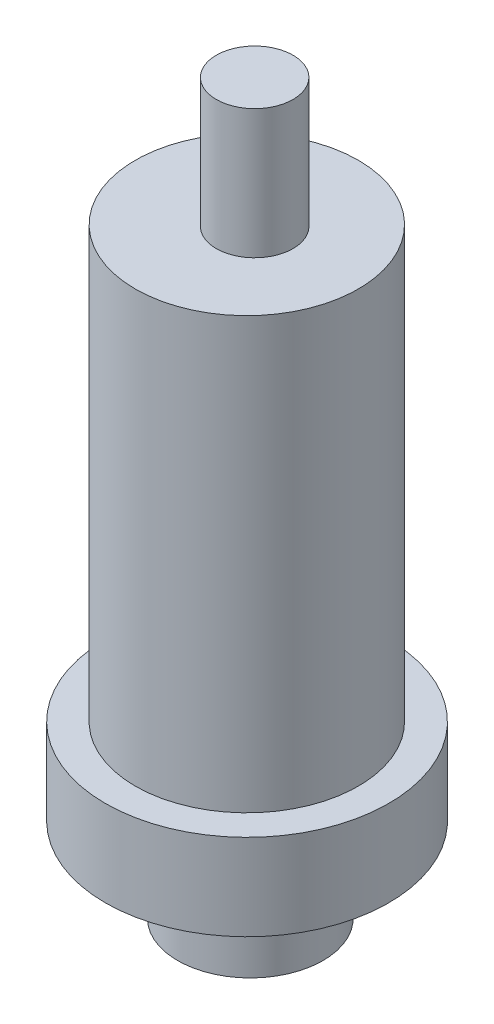
ISO-10303-21;
HEADER;
FILE_DESCRIPTION(('STEP AP214'),'2;1');
FILE_NAME('part.step','',(''),(''),'','','');
FILE_SCHEMA(('AUTOMOTIVE_DESIGN { 1 0 10303 214 1 1 1 1 }'));
ENDSEC;
DATA;
#1=APPLICATION_CONTEXT('core data for automotive mechanical design processes');
#2=APPLICATION_PROTOCOL_DEFINITION('international standard','automotive_design',2000,#1);
#3=PRODUCT_CONTEXT('',#1,'mechanical');
#4=PRODUCT('Part','Part','',(#3));
#5=PRODUCT_RELATED_PRODUCT_CATEGORY('part','',(#4));
#6=PRODUCT_DEFINITION_FORMATION('','',#4);
#7=PRODUCT_DEFINITION_CONTEXT('part definition',#1,'design');
#8=PRODUCT_DEFINITION('design','',#6,#7);
#9=PRODUCT_DEFINITION_SHAPE('','',#8);
#10=(LENGTH_UNIT() NAMED_UNIT(*) SI_UNIT(.MILLI.,.METRE.));
#11=(NAMED_UNIT(*) PLANE_ANGLE_UNIT() SI_UNIT($,.RADIAN.));
#12=(NAMED_UNIT(*) SI_UNIT($,.STERADIAN.) SOLID_ANGLE_UNIT());
#13=UNCERTAINTY_MEASURE_WITH_UNIT(LENGTH_MEASURE(1.E-05),#10,'distance_accuracy_value','');
#14=(GEOMETRIC_REPRESENTATION_CONTEXT(3) GLOBAL_UNCERTAINTY_ASSIGNED_CONTEXT((#13)) GLOBAL_UNIT_ASSIGNED_CONTEXT((#10,
#11,#12)) REPRESENTATION_CONTEXT('',''));
#15=CARTESIAN_POINT('',(0.,0.,0.));
#16=DIRECTION('',(0.,0.,1.));
#17=DIRECTION('',(1.,0.,0.));
#18=AXIS2_PLACEMENT_3D('',#15,#16,#17);
#19=CARTESIAN_POINT('',(0.,10.,-1.80088060511707));
#20=DIRECTION('',(0.,-1.,0.));
#21=DIRECTION('',(0.,0.,-1.));
#22=AXIS2_PLACEMENT_3D('',#19,#20,#21);
#23=CYLINDRICAL_SURFACE('',#22,16.4579037746839);
#24=CARTESIAN_POINT('',(0.,10.,-1.80088060511707));
#25=DIRECTION('',(0.,1.,0.));
#26=DIRECTION('',(0.,0.,1.));
#27=AXIS2_PLACEMENT_3D('',#24,#25,#26);
#28=CIRCLE('',#27,16.4579037746839);
#29=CARTESIAN_POINT('',(0.,10.,14.6570231695668));
#30=VERTEX_POINT('',#29);
#31=EDGE_CURVE('E57',#30,#30,#28,.T.);
#32=ORIENTED_EDGE('',*,*,#31,.F.);
#33=EDGE_LOOP('',(#32));
#34=FACE_BOUND('',#33,.T.);
#35=CARTESIAN_POINT('',(0.,0.,-1.80088060511707));
#36=DIRECTION('',(0.,1.,0.));
#37=DIRECTION('',(0.,0.,1.));
#38=AXIS2_PLACEMENT_3D('',#35,#36,#37);
#39=CIRCLE('',#38,16.4579037746839);
#40=CARTESIAN_POINT('',(0.,0.,14.6570231695668));
#41=VERTEX_POINT('',#40);
#42=EDGE_CURVE('E36',#41,#41,#39,.T.);
#43=ORIENTED_EDGE('',*,*,#42,.T.);
#44=EDGE_LOOP('',(#43));
#45=FACE_BOUND('',#44,.T.);
#46=ADVANCED_FACE('F33',(#34,#45),#23,.T.);
#47=CARTESIAN_POINT('',(0.,10.,-1.80088060511707));
#48=DIRECTION('',(0.,1.,0.));
#49=DIRECTION('',(0.,0.,1.));
#50=AXIS2_PLACEMENT_3D('',#47,#48,#49);
#51=PLANE('',#50);
#52=CARTESIAN_POINT('',(0.,10.,-1.7734498814086));
#53=DIRECTION('',(0.,1.,0.));
#54=DIRECTION('',(0.,0.,1.));
#55=AXIS2_PLACEMENT_3D('',#52,#53,#54);
#56=CIRCLE('',#55,12.9535496853533);
#57=CARTESIAN_POINT('',(0.,10.,11.1800998039447));
#58=VERTEX_POINT('',#57);
#59=EDGE_CURVE('E45',#58,#58,#56,.T.);
#60=ORIENTED_EDGE('',*,*,#59,.F.);
#61=EDGE_LOOP('',(#60));
#62=FACE_BOUND('',#61,.T.);
#63=ORIENTED_EDGE('',*,*,#31,.T.);
#64=EDGE_LOOP('',(#63));
#65=FACE_BOUND('',#64,.T.);
#66=ADVANCED_FACE('F68',(#62,#65),#51,.T.);
#67=CARTESIAN_POINT('',(0.,0.,-1.80088060511707));
#68=DIRECTION('',(0.,1.,0.));
#69=DIRECTION('',(0.,0.,1.));
#70=AXIS2_PLACEMENT_3D('',#67,#68,#69);
#71=PLANE('',#70);
#72=CARTESIAN_POINT('',(0.,0.,-2.17889203507582));
#73=DIRECTION('',(0.,-1.,0.));
#74=DIRECTION('',(0.,0.,-1.));
#75=AXIS2_PLACEMENT_3D('',#72,#73,#74);
#76=CIRCLE('',#75,8.44633714454265);
#77=CARTESIAN_POINT('',(0.,0.,-10.6252291796185));
#78=VERTEX_POINT('',#77);
#79=EDGE_CURVE('E40',#78,#78,#76,.T.);
#80=ORIENTED_EDGE('',*,*,#79,.F.);
#81=EDGE_LOOP('',(#80));
#82=FACE_BOUND('',#81,.T.);
#83=ORIENTED_EDGE('',*,*,#42,.F.);
#84=EDGE_LOOP('',(#83));
#85=FACE_BOUND('',#84,.T.);
#86=ADVANCED_FACE('F65',(#82,#85),#71,.F.);
#87=CARTESIAN_POINT('',(0.,60.,-1.7734498814086));
#88=DIRECTION('',(0.,-1.,0.));
#89=DIRECTION('',(0.,0.,-1.));
#90=AXIS2_PLACEMENT_3D('',#87,#88,#89);
#91=CYLINDRICAL_SURFACE('',#90,12.9535496853533);
#92=CARTESIAN_POINT('',(0.,60.,-1.7734498814086));
#93=DIRECTION('',(0.,1.,0.));
#94=DIRECTION('',(0.,0.,1.));
#95=AXIS2_PLACEMENT_3D('',#92,#93,#94);
#96=CIRCLE('',#95,12.9535496853533);
#97=CARTESIAN_POINT('',(0.,60.,11.1800998039447));
#98=VERTEX_POINT('',#97);
#99=EDGE_CURVE('E52',#98,#98,#96,.T.);
#100=ORIENTED_EDGE('',*,*,#99,.F.);
#101=EDGE_LOOP('',(#100));
#102=FACE_BOUND('',#101,.T.);
#103=ORIENTED_EDGE('',*,*,#59,.T.);
#104=EDGE_LOOP('',(#103));
#105=FACE_BOUND('',#104,.T.);
#106=ADVANCED_FACE('F67',(#102,#105),#91,.T.);
#107=CARTESIAN_POINT('',(0.,60.,-1.7734498814086));
#108=DIRECTION('',(0.,1.,0.));
#109=DIRECTION('',(0.,0.,1.));
#110=AXIS2_PLACEMENT_3D('',#107,#108,#109);
#111=PLANE('',#110);
#112=CARTESIAN_POINT('',(0.642895668787169,60.,-2.04178418553891));
#113=DIRECTION('',(0.,1.,0.));
#114=DIRECTION('',(0.,0.,1.));
#115=AXIS2_PLACEMENT_3D('',#112,#113,#114);
#116=CIRCLE('',#115,4.45625116763635);
#117=CARTESIAN_POINT('',(0.642895668787169,60.,2.41446698209744));
#118=VERTEX_POINT('',#117);
#119=EDGE_CURVE('E10',#118,#118,#116,.T.);
#120=ORIENTED_EDGE('',*,*,#119,.F.);
#121=EDGE_LOOP('',(#120));
#122=FACE_BOUND('',#121,.T.);
#123=ORIENTED_EDGE('',*,*,#99,.T.);
#124=EDGE_LOOP('',(#123));
#125=FACE_BOUND('',#124,.T.);
#126=ADVANCED_FACE('F74',(#122,#125),#111,.T.);
#127=CARTESIAN_POINT('',(0.,-10.,-2.17889203507582));
#128=DIRECTION('',(0.,1.,0.));
#129=DIRECTION('',(0.,0.,1.));
#130=AXIS2_PLACEMENT_3D('',#127,#128,#129);
#131=CYLINDRICAL_SURFACE('',#130,8.44633714454265);
#132=CARTESIAN_POINT('',(0.,-10.,-2.17889203507582));
#133=DIRECTION('',(0.,-1.,0.));
#134=DIRECTION('',(0.,0.,-1.));
#135=AXIS2_PLACEMENT_3D('',#132,#133,#134);
#136=CIRCLE('',#135,8.44633714454265);
#137=CARTESIAN_POINT('',(0.,-10.,-10.6252291796185));
#138=VERTEX_POINT('',#137);
#139=EDGE_CURVE('E50',#138,#138,#136,.T.);
#140=ORIENTED_EDGE('',*,*,#139,.F.);
#141=EDGE_LOOP('',(#140));
#142=FACE_BOUND('',#141,.T.);
#143=ORIENTED_EDGE('',*,*,#79,.T.);
#144=EDGE_LOOP('',(#143));
#145=FACE_BOUND('',#144,.T.);
#146=ADVANCED_FACE('F105',(#142,#145),#131,.T.);
#147=CARTESIAN_POINT('',(0.,-10.,-2.17889203507582));
#148=DIRECTION('',(0.,-1.,0.));
#149=DIRECTION('',(0.,0.,-1.));
#150=AXIS2_PLACEMENT_3D('',#147,#148,#149);
#151=PLANE('',#150);
#152=ORIENTED_EDGE('',*,*,#139,.T.);
#153=EDGE_LOOP('',(#152));
#154=FACE_BOUND('',#153,.T.);
#155=ADVANCED_FACE('F110',(#154),#151,.T.);
#156=CARTESIAN_POINT('',(0.642895668787169,75.,-2.04178418553891));
#157=DIRECTION('',(0.,-1.,0.));
#158=DIRECTION('',(0.,0.,-1.));
#159=AXIS2_PLACEMENT_3D('',#156,#157,#158);
#160=CYLINDRICAL_SURFACE('',#159,4.45625116763635);
#161=CARTESIAN_POINT('',(0.642895668787169,75.,-2.04178418553891));
#162=DIRECTION('',(0.,1.,0.));
#163=DIRECTION('',(0.,0.,1.));
#164=AXIS2_PLACEMENT_3D('',#161,#162,#163);
#165=CIRCLE('',#164,4.45625116763635);
#166=CARTESIAN_POINT('',(0.642895668787169,75.,2.41446698209744));
#167=VERTEX_POINT('',#166);
#168=EDGE_CURVE('E49',#167,#167,#165,.T.);
#169=ORIENTED_EDGE('',*,*,#168,.F.);
#170=EDGE_LOOP('',(#169));
#171=FACE_BOUND('',#170,.T.);
#172=ORIENTED_EDGE('',*,*,#119,.T.);
#173=EDGE_LOOP('',(#172));
#174=FACE_BOUND('',#173,.T.);
#175=ADVANCED_FACE('F121',(#171,#174),#160,.T.);
#176=CARTESIAN_POINT('',(0.642895668787169,75.,-2.04178418553891));
#177=DIRECTION('',(0.,1.,0.));
#178=DIRECTION('',(0.,0.,1.));
#179=AXIS2_PLACEMENT_3D('',#176,#177,#178);
#180=PLANE('',#179);
#181=ORIENTED_EDGE('',*,*,#168,.T.);
#182=EDGE_LOOP('',(#181));
#183=FACE_BOUND('',#182,.T.);
#184=ADVANCED_FACE('F138',(#183),#180,.T.);
#185=CLOSED_SHELL('',(#46,#66,#86,#106,#126,#146,#155,#175,#184));
#186=MANIFOLD_SOLID_BREP('B2',#185);
#187=ADVANCED_BREP_SHAPE_REPRESENTATION('',(#18,#186),#14);
#188=SHAPE_DEFINITION_REPRESENTATION(#9,#187);
ENDSEC;
END-ISO-10303-21;
